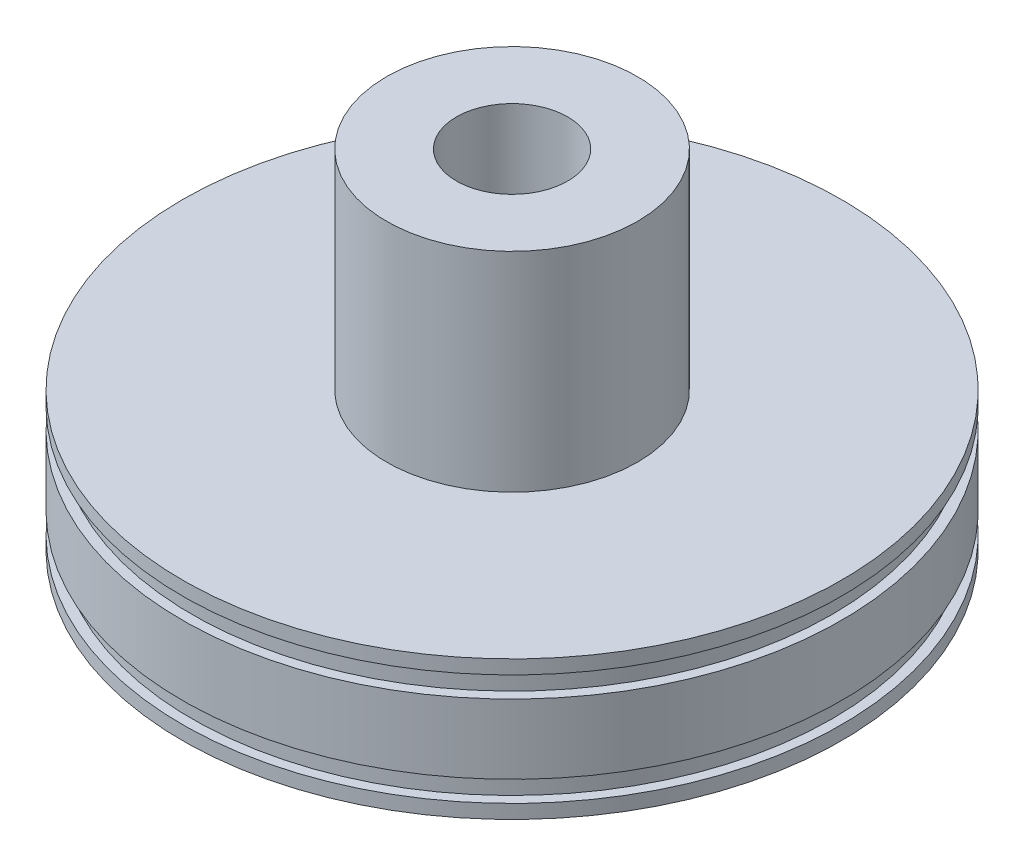
ISO-10303-21;
HEADER;
FILE_DESCRIPTION(('STEP AP214'),'2;1');
FILE_NAME('part.step','',(''),(''),'','','');
FILE_SCHEMA(('AUTOMOTIVE_DESIGN { 1 0 10303 214 1 1 1 1 }'));
ENDSEC;
DATA;
#1=APPLICATION_CONTEXT('core data for automotive mechanical design processes');
#2=APPLICATION_PROTOCOL_DEFINITION('international standard','automotive_design',2000,#1);
#3=PRODUCT_CONTEXT('',#1,'mechanical');
#4=PRODUCT('Part','Part','',(#3));
#5=PRODUCT_RELATED_PRODUCT_CATEGORY('part','',(#4));
#6=PRODUCT_DEFINITION_FORMATION('','',#4);
#7=PRODUCT_DEFINITION_CONTEXT('part definition',#1,'design');
#8=PRODUCT_DEFINITION('design','',#6,#7);
#9=PRODUCT_DEFINITION_SHAPE('','',#8);
#10=(LENGTH_UNIT() NAMED_UNIT(*) SI_UNIT(.MILLI.,.METRE.));
#11=(NAMED_UNIT(*) PLANE_ANGLE_UNIT() SI_UNIT($,.RADIAN.));
#12=(NAMED_UNIT(*) SI_UNIT($,.STERADIAN.) SOLID_ANGLE_UNIT());
#13=UNCERTAINTY_MEASURE_WITH_UNIT(LENGTH_MEASURE(1.E-05),#10,'distance_accuracy_value','');
#14=(GEOMETRIC_REPRESENTATION_CONTEXT(3) GLOBAL_UNCERTAINTY_ASSIGNED_CONTEXT((#13)) GLOBAL_UNIT_ASSIGNED_CONTEXT((#10,
#11,#12)) REPRESENTATION_CONTEXT('',''));
#15=CARTESIAN_POINT('',(0.,0.,0.));
#16=DIRECTION('',(0.,0.,1.));
#17=DIRECTION('',(1.,0.,0.));
#18=AXIS2_PLACEMENT_3D('',#15,#16,#17);
#19=CARTESIAN_POINT('',(0.,30.7853037721106,0.));
#20=DIRECTION('',(0.,-1.,0.));
#21=DIRECTION('',(1.,0.,0.));
#22=AXIS2_PLACEMENT_3D('',#19,#20,#21);
#23=PLANE('',#22);
#24=CARTESIAN_POINT('',(0.,30.7853037721106,0.));
#25=DIRECTION('',(0.,1.,0.));
#26=DIRECTION('',(-1.,0.,0.));
#27=AXIS2_PLACEMENT_3D('',#24,#25,#26);
#28=CIRCLE('',#27,30.099);
#29=CARTESIAN_POINT('',(-30.099,30.7853037721106,0.));
#30=VERTEX_POINT('',#29);
#31=EDGE_CURVE('E104',#30,#30,#28,.T.);
#32=ORIENTED_EDGE('',*,*,#31,.T.);
#33=EDGE_LOOP('',(#32));
#34=FACE_BOUND('',#33,.T.);
#35=CARTESIAN_POINT('',(0.,30.7853037721106,0.));
#36=DIRECTION('',(0.,-1.,0.));
#37=DIRECTION('',(1.,0.,0.));
#38=AXIS2_PLACEMENT_3D('',#35,#36,#37);
#39=CIRCLE('',#38,11.4554);
#40=CARTESIAN_POINT('',(11.4554,30.7853037721106,0.));
#41=VERTEX_POINT('',#40);
#42=EDGE_CURVE('E11',#41,#41,#39,.F.);
#43=ORIENTED_EDGE('',*,*,#42,.F.);
#44=EDGE_LOOP('',(#43));
#45=FACE_BOUND('',#44,.T.);
#46=ADVANCED_FACE('F35',(#34,#45),#23,.F.);
#47=CARTESIAN_POINT('',(0.,21.2603037721106,0.));
#48=DIRECTION('',(0.,1.,0.));
#49=DIRECTION('',(-1.,0.,0.));
#50=AXIS2_PLACEMENT_3D('',#47,#48,#49);
#51=PLANE('',#50);
#52=CARTESIAN_POINT('',(0.,21.2603037721106,0.));
#53=DIRECTION('',(0.,1.,0.));
#54=DIRECTION('',(-1.,0.,0.));
#55=AXIS2_PLACEMENT_3D('',#52,#53,#54);
#56=CIRCLE('',#55,30.099);
#57=CARTESIAN_POINT('',(-30.099,21.2603037721106,0.));
#58=VERTEX_POINT('',#57);
#59=EDGE_CURVE('E42',#58,#58,#56,.T.);
#60=ORIENTED_EDGE('',*,*,#59,.F.);
#61=EDGE_LOOP('',(#60));
#62=FACE_BOUND('',#61,.T.);
#63=CARTESIAN_POINT('',(0.,21.2603037721106,0.));
#64=DIRECTION('',(0.,1.,0.));
#65=DIRECTION('',(-1.,0.,0.));
#66=AXIS2_PLACEMENT_3D('',#63,#64,#65);
#67=CIRCLE('',#66,29.21);
#68=CARTESIAN_POINT('',(-29.21,21.2603037721106,0.));
#69=VERTEX_POINT('',#68);
#70=EDGE_CURVE('E115',#69,#69,#67,.T.);
#71=ORIENTED_EDGE('',*,*,#70,.T.);
#72=EDGE_LOOP('',(#71));
#73=FACE_BOUND('',#72,.T.);
#74=ADVANCED_FACE('F37',(#62,#73),#51,.F.);
#75=CARTESIAN_POINT('',(0.,30.7853037721106,0.));
#76=DIRECTION('',(0.,1.,0.));
#77=DIRECTION('',(-1.,0.,0.));
#78=AXIS2_PLACEMENT_3D('',#75,#76,#77);
#79=CYLINDRICAL_SURFACE('',#78,30.099);
#80=CARTESIAN_POINT('',(0.,27.6103037721106,0.));
#81=DIRECTION('',(0.,1.,0.));
#82=DIRECTION('',(-1.,0.,0.));
#83=AXIS2_PLACEMENT_3D('',#80,#81,#82);
#84=CIRCLE('',#83,30.099);
#85=CARTESIAN_POINT('',(-30.099,27.6103037721106,0.));
#86=VERTEX_POINT('',#85);
#87=EDGE_CURVE('E90',#86,#86,#84,.T.);
#88=ORIENTED_EDGE('',*,*,#87,.F.);
#89=EDGE_LOOP('',(#88));
#90=FACE_BOUND('',#89,.T.);
#91=ORIENTED_EDGE('',*,*,#59,.T.);
#92=EDGE_LOOP('',(#91));
#93=FACE_BOUND('',#92,.T.);
#94=ADVANCED_FACE('F68',(#90,#93),#79,.T.);
#95=CARTESIAN_POINT('',(0.,27.6103037721106,0.));
#96=DIRECTION('',(0.,1.,0.));
#97=DIRECTION('',(-1.,0.,0.));
#98=AXIS2_PLACEMENT_3D('',#95,#96,#97);
#99=PLANE('',#98);
#100=ORIENTED_EDGE('',*,*,#87,.T.);
#101=EDGE_LOOP('',(#100));
#102=FACE_BOUND('',#101,.T.);
#103=CARTESIAN_POINT('',(0.,27.6103037721106,0.));
#104=DIRECTION('',(0.,1.,0.));
#105=DIRECTION('',(-1.,0.,0.));
#106=AXIS2_PLACEMENT_3D('',#103,#104,#105);
#107=CIRCLE('',#106,29.21);
#108=CARTESIAN_POINT('',(-29.21,27.6103037721106,0.));
#109=VERTEX_POINT('',#108);
#110=EDGE_CURVE('E93',#109,#109,#107,.T.);
#111=ORIENTED_EDGE('',*,*,#110,.F.);
#112=EDGE_LOOP('',(#111));
#113=FACE_BOUND('',#112,.T.);
#114=ADVANCED_FACE('F79',(#102,#113),#99,.T.);
#115=CARTESIAN_POINT('',(0.,30.7853037721106,0.));
#116=DIRECTION('',(0.,1.,0.));
#117=DIRECTION('',(-1.,0.,0.));
#118=AXIS2_PLACEMENT_3D('',#115,#116,#117);
#119=CYLINDRICAL_SURFACE('',#118,29.21);
#120=ORIENTED_EDGE('',*,*,#110,.T.);
#121=EDGE_LOOP('',(#120));
#122=FACE_BOUND('',#121,.T.);
#123=CARTESIAN_POINT('',(0.,29.5153037721106,0.));
#124=DIRECTION('',(0.,1.,0.));
#125=DIRECTION('',(-1.,0.,0.));
#126=AXIS2_PLACEMENT_3D('',#123,#124,#125);
#127=CIRCLE('',#126,29.21);
#128=CARTESIAN_POINT('',(-29.21,29.5153037721106,0.));
#129=VERTEX_POINT('',#128);
#130=EDGE_CURVE('E98',#129,#129,#127,.T.);
#131=ORIENTED_EDGE('',*,*,#130,.F.);
#132=EDGE_LOOP('',(#131));
#133=FACE_BOUND('',#132,.T.);
#134=ADVANCED_FACE('F75',(#122,#133),#119,.T.);
#135=CARTESIAN_POINT('',(0.,29.5153037721106,0.));
#136=DIRECTION('',(0.,-1.,0.));
#137=DIRECTION('',(1.,0.,0.));
#138=AXIS2_PLACEMENT_3D('',#135,#136,#137);
#139=PLANE('',#138);
#140=ORIENTED_EDGE('',*,*,#130,.T.);
#141=EDGE_LOOP('',(#140));
#142=FACE_BOUND('',#141,.T.);
#143=CARTESIAN_POINT('',(0.,29.5153037721106,0.));
#144=DIRECTION('',(0.,1.,0.));
#145=DIRECTION('',(-1.,0.,0.));
#146=AXIS2_PLACEMENT_3D('',#143,#144,#145);
#147=CIRCLE('',#146,30.099);
#148=CARTESIAN_POINT('',(-30.099,29.5153037721106,0.));
#149=VERTEX_POINT('',#148);
#150=EDGE_CURVE('E101',#149,#149,#147,.T.);
#151=ORIENTED_EDGE('',*,*,#150,.F.);
#152=EDGE_LOOP('',(#151));
#153=FACE_BOUND('',#152,.T.);
#154=ADVANCED_FACE('F58',(#142,#153),#139,.T.);
#155=CARTESIAN_POINT('',(0.,30.7853037721106,0.));
#156=DIRECTION('',(0.,1.,0.));
#157=DIRECTION('',(-1.,0.,0.));
#158=AXIS2_PLACEMENT_3D('',#155,#156,#157);
#159=CYLINDRICAL_SURFACE('',#158,30.099);
#160=ORIENTED_EDGE('',*,*,#31,.F.);
#161=EDGE_LOOP('',(#160));
#162=FACE_BOUND('',#161,.T.);
#163=ORIENTED_EDGE('',*,*,#150,.T.);
#164=EDGE_LOOP('',(#163));
#165=FACE_BOUND('',#164,.T.);
#166=ADVANCED_FACE('F48',(#162,#165),#159,.T.);
#167=CARTESIAN_POINT('',(0.,0.,0.));
#168=DIRECTION('',(0.,1.,0.));
#169=DIRECTION('',(-1.,0.,0.));
#170=AXIS2_PLACEMENT_3D('',#167,#168,#169);
#171=CONICAL_SURFACE('',#170,0.,1.02974425867665);
#172=CARTESIAN_POINT('',(0.,18.0853037721106,0.));
#173=DIRECTION('',(0.,1.,0.));
#174=DIRECTION('',(-1.,0.,0.));
#175=AXIS2_PLACEMENT_3D('',#172,#173,#174);
#176=CIRCLE('',#175,30.099);
#177=CARTESIAN_POINT('',(-30.099,18.0853037721106,0.));
#178=VERTEX_POINT('',#177);
#179=EDGE_CURVE('E106',#178,#178,#176,.T.);
#180=ORIENTED_EDGE('',*,*,#179,.F.);
#181=EDGE_LOOP('',(#180));
#182=FACE_BOUND('',#181,.T.);
#183=CARTESIAN_POINT('',(0.,0.,0.));
#184=VERTEX_POINT('',#183);
#185=VERTEX_LOOP('',#184);
#186=FACE_BOUND('',#185,.T.);
#187=ADVANCED_FACE('F45',(#182,#186),#171,.T.);
#188=CARTESIAN_POINT('',(0.,30.7853037721106,0.));
#189=DIRECTION('',(0.,1.,0.));
#190=DIRECTION('',(-1.,0.,0.));
#191=AXIS2_PLACEMENT_3D('',#188,#189,#190);
#192=CYLINDRICAL_SURFACE('',#191,30.099);
#193=CARTESIAN_POINT('',(0.,19.3553037721106,0.));
#194=DIRECTION('',(0.,1.,0.));
#195=DIRECTION('',(-1.,0.,0.));
#196=AXIS2_PLACEMENT_3D('',#193,#194,#195);
#197=CIRCLE('',#196,30.099);
#198=CARTESIAN_POINT('',(-30.099,19.3553037721106,0.));
#199=VERTEX_POINT('',#198);
#200=EDGE_CURVE('E109',#199,#199,#197,.T.);
#201=ORIENTED_EDGE('',*,*,#200,.F.);
#202=EDGE_LOOP('',(#201));
#203=FACE_BOUND('',#202,.T.);
#204=ORIENTED_EDGE('',*,*,#179,.T.);
#205=EDGE_LOOP('',(#204));
#206=FACE_BOUND('',#205,.T.);
#207=ADVANCED_FACE('F47',(#203,#206),#192,.T.);
#208=CARTESIAN_POINT('',(0.,19.3553037721106,0.));
#209=DIRECTION('',(0.,-1.,0.));
#210=DIRECTION('',(1.,0.,0.));
#211=AXIS2_PLACEMENT_3D('',#208,#209,#210);
#212=PLANE('',#211);
#213=CARTESIAN_POINT('',(0.,19.3553037721106,0.));
#214=DIRECTION('',(0.,1.,0.));
#215=DIRECTION('',(-1.,0.,0.));
#216=AXIS2_PLACEMENT_3D('',#213,#214,#215);
#217=CIRCLE('',#216,29.21);
#218=CARTESIAN_POINT('',(-29.21,19.3553037721106,0.));
#219=VERTEX_POINT('',#218);
#220=EDGE_CURVE('E112',#219,#219,#217,.T.);
#221=ORIENTED_EDGE('',*,*,#220,.F.);
#222=EDGE_LOOP('',(#221));
#223=FACE_BOUND('',#222,.T.);
#224=ORIENTED_EDGE('',*,*,#200,.T.);
#225=EDGE_LOOP('',(#224));
#226=FACE_BOUND('',#225,.T.);
#227=ADVANCED_FACE('F55',(#223,#226),#212,.F.);
#228=CARTESIAN_POINT('',(0.,30.7853037721106,0.));
#229=DIRECTION('',(0.,1.,0.));
#230=DIRECTION('',(-1.,0.,0.));
#231=AXIS2_PLACEMENT_3D('',#228,#229,#230);
#232=CYLINDRICAL_SURFACE('',#231,29.21);
#233=ORIENTED_EDGE('',*,*,#70,.F.);
#234=EDGE_LOOP('',(#233));
#235=FACE_BOUND('',#234,.T.);
#236=ORIENTED_EDGE('',*,*,#220,.T.);
#237=EDGE_LOOP('',(#236));
#238=FACE_BOUND('',#237,.T.);
#239=ADVANCED_FACE('F145',(#235,#238),#232,.T.);
#240=CARTESIAN_POINT('',(0.,49.8353037721106,0.));
#241=DIRECTION('',(0.,-1.,0.));
#242=DIRECTION('',(1.,0.,0.));
#243=AXIS2_PLACEMENT_3D('',#240,#241,#242);
#244=CYLINDRICAL_SURFACE('',#243,11.4554);
#245=CARTESIAN_POINT('',(0.,49.8353037721106,0.));
#246=DIRECTION('',(0.,1.,0.));
#247=DIRECTION('',(-1.,0.,0.));
#248=AXIS2_PLACEMENT_3D('',#245,#246,#247);
#249=CIRCLE('',#248,11.4554);
#250=CARTESIAN_POINT('',(11.4554,49.8353037721106,0.));
#251=VERTEX_POINT('',#250);
#252=EDGE_CURVE('E118',#251,#251,#249,.T.);
#253=CARTESIAN_POINT('',(11.4554,49.8353037721106,0.));
#254=CARTESIAN_POINT('',(11.4554,49.6368662721106,0.));
#255=CARTESIAN_POINT('',(11.4554,49.4384287721106,0.));
#256=CARTESIAN_POINT('',(11.4554,49.0415537721106,0.));
#257=CARTESIAN_POINT('',(11.4554,48.8431162721106,0.));
#258=CARTESIAN_POINT('',(11.4554,48.4462412721106,0.));
#259=CARTESIAN_POINT('',(11.4554,48.2478037721106,0.));
#260=CARTESIAN_POINT('',(11.4554,47.8509287721106,0.));
#261=CARTESIAN_POINT('',(11.4554,47.6524912721106,0.));
#262=CARTESIAN_POINT('',(11.4554,47.2556162721106,0.));
#263=CARTESIAN_POINT('',(11.4554,47.0571787721106,0.));
#264=CARTESIAN_POINT('',(11.4554,46.6603037721106,0.));
#265=CARTESIAN_POINT('',(11.4554,46.4618662721106,0.));
#266=CARTESIAN_POINT('',(11.4554,46.0649912721106,0.));
#267=CARTESIAN_POINT('',(11.4554,45.8665537721106,0.));
#268=CARTESIAN_POINT('',(11.4554,45.4696787721106,0.));
#269=CARTESIAN_POINT('',(11.4554,45.2712412721106,0.));
#270=CARTESIAN_POINT('',(11.4554,44.8743662721106,0.));
#271=CARTESIAN_POINT('',(11.4554,44.6759287721106,0.));
#272=CARTESIAN_POINT('',(11.4554,44.2790537721106,0.));
#273=CARTESIAN_POINT('',(11.4554,44.0806162721106,0.));
#274=CARTESIAN_POINT('',(11.4554,43.6837412721106,0.));
#275=CARTESIAN_POINT('',(11.4554,43.4853037721106,0.));
#276=CARTESIAN_POINT('',(11.4554,43.0884287721106,0.));
#277=CARTESIAN_POINT('',(11.4554,42.8899912721106,0.));
#278=CARTESIAN_POINT('',(11.4554,42.4931162721106,0.));
#279=CARTESIAN_POINT('',(11.4554,42.2946787721106,0.));
#280=CARTESIAN_POINT('',(11.4554,41.8978037721106,0.));
#281=CARTESIAN_POINT('',(11.4554,41.6993662721106,0.));
#282=CARTESIAN_POINT('',(11.4554,41.3024912721106,0.));
#283=CARTESIAN_POINT('',(11.4554,41.1040537721106,0.));
#284=CARTESIAN_POINT('',(11.4554,40.7071787721106,0.));
#285=CARTESIAN_POINT('',(11.4554,40.5087412721106,0.));
#286=CARTESIAN_POINT('',(11.4554,40.1118662721106,0.));
#287=CARTESIAN_POINT('',(11.4554,39.9134287721106,0.));
#288=CARTESIAN_POINT('',(11.4554,39.5165537721106,0.));
#289=CARTESIAN_POINT('',(11.4554,39.3181162721106,0.));
#290=CARTESIAN_POINT('',(11.4554,38.9212412721106,0.));
#291=CARTESIAN_POINT('',(11.4554,38.7228037721106,0.));
#292=CARTESIAN_POINT('',(11.4554,38.3259287721106,0.));
#293=CARTESIAN_POINT('',(11.4554,38.1274912721106,0.));
#294=CARTESIAN_POINT('',(11.4554,37.7306162721106,0.));
#295=CARTESIAN_POINT('',(11.4554,37.5321787721106,0.));
#296=CARTESIAN_POINT('',(11.4554,37.1353037721106,0.));
#297=CARTESIAN_POINT('',(11.4554,36.9368662721106,0.));
#298=CARTESIAN_POINT('',(11.4554,36.5399912721106,0.));
#299=CARTESIAN_POINT('',(11.4554,36.3415537721106,0.));
#300=CARTESIAN_POINT('',(11.4554,35.9446787721106,0.));
#301=CARTESIAN_POINT('',(11.4554,35.7462412721106,0.));
#302=CARTESIAN_POINT('',(11.4554,35.3493662721106,0.));
#303=CARTESIAN_POINT('',(11.4554,35.1509287721106,0.));
#304=CARTESIAN_POINT('',(11.4554,34.7540537721106,0.));
#305=CARTESIAN_POINT('',(11.4554,34.5556162721106,0.));
#306=CARTESIAN_POINT('',(11.4554,34.1587412721106,0.));
#307=CARTESIAN_POINT('',(11.4554,33.9603037721106,0.));
#308=CARTESIAN_POINT('',(11.4554,33.5634287721106,0.));
#309=CARTESIAN_POINT('',(11.4554,33.3649912721106,0.));
#310=CARTESIAN_POINT('',(11.4554,32.9681162721106,0.));
#311=CARTESIAN_POINT('',(11.4554,32.7696787721106,0.));
#312=CARTESIAN_POINT('',(11.4554,32.3728037721106,0.));
#313=CARTESIAN_POINT('',(11.4554,32.1743662721106,0.));
#314=CARTESIAN_POINT('',(11.4554,31.7774912721106,0.));
#315=CARTESIAN_POINT('',(11.4554,31.5790537721106,0.));
#316=CARTESIAN_POINT('',(11.4554,31.1821787721106,0.));
#317=CARTESIAN_POINT('',(11.4554,30.9837412721106,0.));
#318=CARTESIAN_POINT('',(11.4554,30.7853037721106,0.));
#319=B_SPLINE_CURVE_WITH_KNOTS('',3,(#253,#254,#255,#256,#257,#258,#259,#260,#261,#262,#263,
#264,#265,#266,#267,#268,#269,#270,#271,#272,#273,#274,#275,#276,#277,#278,#279,#280,#281,#282,
#283,#284,#285,#286,#287,#288,#289,#290,#291,#292,#293,#294,#295,#296,#297,#298,#299,#300,#301,
#302,#303,#304,#305,#306,#307,#308,#309,#310,#311,#312,#313,#314,#315,#316,#317,#318),
.UNSPECIFIED.,.F.,.F.,(4,2,2,2,2,2,2,2,2,2,2,2,2,2,2,2,2,2,2,2,2,2,2,2,2,2,2,2,2,2,2,2,4),(0.,
0.5953125,1.190625,1.7859375,2.38125,2.9765625,3.571875,4.1671875,4.7625,5.3578125,5.953125,
6.5484375,7.14375,7.7390625,8.334375,8.92968750000001,9.52500000000001,10.1203125,10.715625,
11.3109375,11.90625,12.5015625,13.096875,13.6921875,14.2875,14.8828125,15.478125,16.0734375,
16.66875,17.2640625,17.859375,18.4546875,19.05),.UNSPECIFIED.);
#320=EDGE_CURVE('BSEAM139',#251,#41,#319,.T.);
#321=ORIENTED_EDGE('',*,*,#252,.F.);
#322=ORIENTED_EDGE('',*,*,#42,.T.);
#323=ORIENTED_EDGE('',*,*,#320,.T.);
#324=ORIENTED_EDGE('',*,*,#320,.F.);
#325=EDGE_LOOP('',(#321,#323,#322,#324));
#326=FACE_BOUND('',#325,.T.);
#327=ADVANCED_FACE('F139',(#326),#244,.T.);
#328=CARTESIAN_POINT('',(0.,49.8353037721106,0.));
#329=DIRECTION('',(0.,1.,0.));
#330=DIRECTION('',(-1.,0.,0.));
#331=AXIS2_PLACEMENT_3D('',#328,#329,#330);
#332=PLANE('',#331);
#333=CARTESIAN_POINT('',(0.,49.8353037721106,0.));
#334=DIRECTION('',(0.,1.,0.));
#335=DIRECTION('',(-1.,0.,0.));
#336=AXIS2_PLACEMENT_3D('',#333,#334,#335);
#337=CIRCLE('',#336,5.08);
#338=CARTESIAN_POINT('',(-5.08000000000002,49.8353037721106,0.));
#339=VERTEX_POINT('',#338);
#340=EDGE_CURVE('E122',#339,#339,#337,.T.);
#341=ORIENTED_EDGE('',*,*,#340,.F.);
#342=EDGE_LOOP('',(#341));
#343=FACE_BOUND('',#342,.T.);
#344=ORIENTED_EDGE('',*,*,#252,.T.);
#345=EDGE_LOOP('',(#344));
#346=FACE_BOUND('',#345,.T.);
#347=ADVANCED_FACE('F133',(#343,#346),#332,.T.);
#348=CARTESIAN_POINT('',(0.,37.1353037721106,0.));
#349=DIRECTION('',(0.,1.,0.));
#350=DIRECTION('',(-1.,0.,0.));
#351=AXIS2_PLACEMENT_3D('',#348,#349,#350);
#352=CYLINDRICAL_SURFACE('',#351,5.08);
#353=CARTESIAN_POINT('',(0.,37.1353037721106,0.));
#354=DIRECTION('',(0.,1.,0.));
#355=DIRECTION('',(-1.,0.,0.));
#356=AXIS2_PLACEMENT_3D('',#353,#354,#355);
#357=CIRCLE('',#356,5.08);
#358=CARTESIAN_POINT('',(-5.08000000000002,37.1353037721106,0.));
#359=VERTEX_POINT('',#358);
#360=EDGE_CURVE('E121',#359,#359,#357,.T.);
#361=ORIENTED_EDGE('',*,*,#360,.F.);
#362=EDGE_LOOP('',(#361));
#363=FACE_BOUND('',#362,.T.);
#364=ORIENTED_EDGE('',*,*,#340,.T.);
#365=EDGE_LOOP('',(#364));
#366=FACE_BOUND('',#365,.T.);
#367=ADVANCED_FACE('F130',(#363,#366),#352,.F.);
#368=CARTESIAN_POINT('',(0.,37.1353037721106,0.));
#369=DIRECTION('',(0.,1.,0.));
#370=DIRECTION('',(-1.,0.,0.));
#371=AXIS2_PLACEMENT_3D('',#368,#369,#370);
#372=PLANE('',#371);
#373=ORIENTED_EDGE('',*,*,#360,.T.);
#374=EDGE_LOOP('',(#373));
#375=FACE_BOUND('',#374,.T.);
#376=ADVANCED_FACE('F128',(#375),#372,.T.);
#377=CLOSED_SHELL('',(#46,#74,#94,#114,#134,#154,#166,#187,#207,#227,#239,#327,#347,#367,#376));
#378=MANIFOLD_SOLID_BREP('B2',#377);
#379=ADVANCED_BREP_SHAPE_REPRESENTATION('',(#18,#378),#14);
#380=SHAPE_DEFINITION_REPRESENTATION(#9,#379);
ENDSEC;
END-ISO-10303-21;
